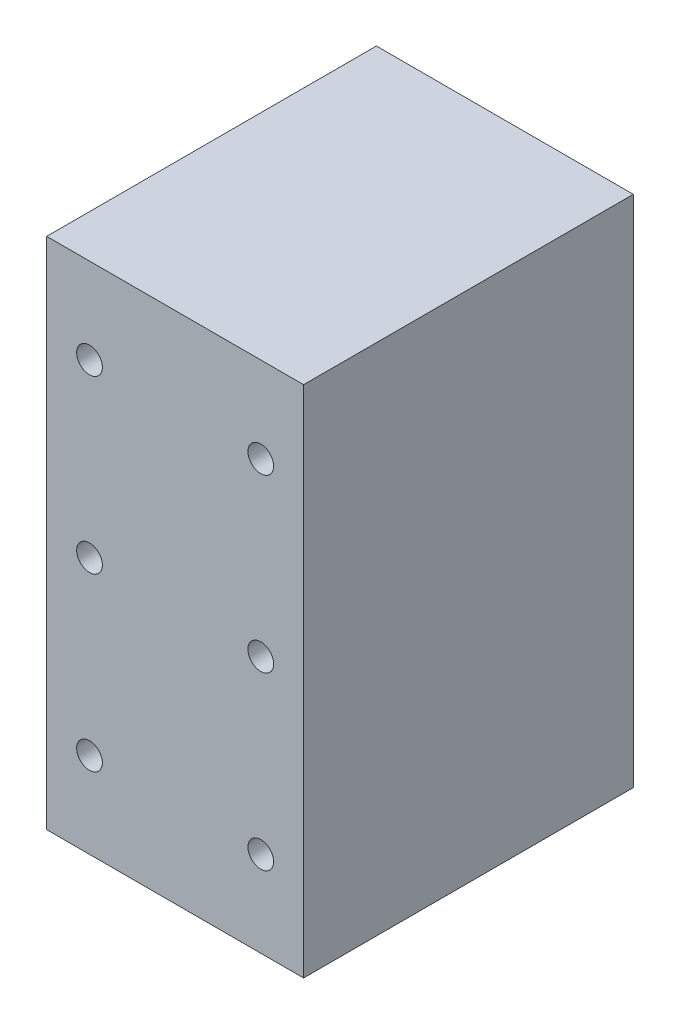
ISO-10303-21;
HEADER;
FILE_DESCRIPTION(('STEP AP214'),'2;1');
FILE_NAME('part.step','',(''),(''),'','','');
FILE_SCHEMA(('AUTOMOTIVE_DESIGN { 1 0 10303 214 1 1 1 1 }'));
ENDSEC;
DATA;
#1=APPLICATION_CONTEXT('core data for automotive mechanical design processes');
#2=APPLICATION_PROTOCOL_DEFINITION('international standard','automotive_design',2000,#1);
#3=PRODUCT_CONTEXT('',#1,'mechanical');
#4=PRODUCT('Part','Part','',(#3));
#5=PRODUCT_RELATED_PRODUCT_CATEGORY('part','',(#4));
#6=PRODUCT_DEFINITION_FORMATION('','',#4);
#7=PRODUCT_DEFINITION_CONTEXT('part definition',#1,'design');
#8=PRODUCT_DEFINITION('design','',#6,#7);
#9=PRODUCT_DEFINITION_SHAPE('','',#8);
#10=(LENGTH_UNIT() NAMED_UNIT(*) SI_UNIT(.MILLI.,.METRE.));
#11=(NAMED_UNIT(*) PLANE_ANGLE_UNIT() SI_UNIT($,.RADIAN.));
#12=(NAMED_UNIT(*) SI_UNIT($,.STERADIAN.) SOLID_ANGLE_UNIT());
#13=UNCERTAINTY_MEASURE_WITH_UNIT(LENGTH_MEASURE(1.E-05),#10,'distance_accuracy_value','');
#14=(GEOMETRIC_REPRESENTATION_CONTEXT(3) GLOBAL_UNCERTAINTY_ASSIGNED_CONTEXT((#13)) GLOBAL_UNIT_ASSIGNED_CONTEXT((#10,
#11,#12)) REPRESENTATION_CONTEXT('',''));
#15=CARTESIAN_POINT('',(0.,0.,0.));
#16=DIRECTION('',(0.,0.,1.));
#17=DIRECTION('',(1.,0.,0.));
#18=AXIS2_PLACEMENT_3D('',#15,#16,#17);
#19=CARTESIAN_POINT('',(-15.,-30.,38.5));
#20=DIRECTION('',(1.,0.,0.));
#21=DIRECTION('',(0.,0.,-1.));
#22=AXIS2_PLACEMENT_3D('',#19,#20,#21);
#23=PLANE('',#22);
#24=DIRECTION('',(0.,-1.,0.));
#25=VECTOR('',#24,1.);
#26=CARTESIAN_POINT('',(-15.,-30.,0.));
#27=LINE('',#26,#25);
#28=CARTESIAN_POINT('',(-15.,30.,0.));
#29=VERTEX_POINT('',#28);
#30=CARTESIAN_POINT('',(-15.,-30.,0.));
#31=VERTEX_POINT('',#30);
#32=EDGE_CURVE('E100',#29,#31,#27,.T.);
#33=ORIENTED_EDGE('',*,*,#32,.T.);
#34=DIRECTION('',(0.,0.,-1.));
#35=VECTOR('',#34,1.);
#36=CARTESIAN_POINT('',(-15.,-30.,38.5));
#37=LINE('',#36,#35);
#38=CARTESIAN_POINT('',(-15.,-30.,38.5));
#39=VERTEX_POINT('',#38);
#40=EDGE_CURVE('E91',#39,#31,#37,.T.);
#41=ORIENTED_EDGE('',*,*,#40,.F.);
#42=DIRECTION('',(0.,-1.,0.));
#43=VECTOR('',#42,1.);
#44=CARTESIAN_POINT('',(-15.,-30.,38.5));
#45=LINE('',#44,#43);
#46=CARTESIAN_POINT('',(-15.,30.,38.5));
#47=VERTEX_POINT('',#46);
#48=EDGE_CURVE('E85',#47,#39,#45,.T.);
#49=ORIENTED_EDGE('',*,*,#48,.F.);
#50=DIRECTION('',(0.,0.,-1.));
#51=VECTOR('',#50,1.);
#52=CARTESIAN_POINT('',(-15.,30.,38.5));
#53=LINE('',#52,#51);
#54=EDGE_CURVE('E96',#47,#29,#53,.T.);
#55=ORIENTED_EDGE('',*,*,#54,.T.);
#56=EDGE_LOOP('',(#33,#41,#49,#55));
#57=FACE_BOUND('',#56,.T.);
#58=ADVANCED_FACE('F31',(#57),#23,.F.);
#59=CARTESIAN_POINT('',(15.,-30.,38.5));
#60=DIRECTION('',(0.,1.,0.));
#61=DIRECTION('',(-1.,0.,0.));
#62=AXIS2_PLACEMENT_3D('',#59,#60,#61);
#63=PLANE('',#62);
#64=DIRECTION('',(1.,0.,0.));
#65=VECTOR('',#64,1.);
#66=CARTESIAN_POINT('',(15.,-30.,0.));
#67=LINE('',#66,#65);
#68=CARTESIAN_POINT('',(15.,-30.,0.));
#69=VERTEX_POINT('',#68);
#70=EDGE_CURVE('E90',#31,#69,#67,.T.);
#71=ORIENTED_EDGE('',*,*,#70,.T.);
#72=DIRECTION('',(0.,0.,-1.));
#73=VECTOR('',#72,1.);
#74=CARTESIAN_POINT('',(15.,-30.,38.5));
#75=LINE('',#74,#73);
#76=CARTESIAN_POINT('',(15.,-30.,38.5));
#77=VERTEX_POINT('',#76);
#78=EDGE_CURVE('E88',#77,#69,#75,.T.);
#79=ORIENTED_EDGE('',*,*,#78,.F.);
#80=DIRECTION('',(1.,0.,0.));
#81=VECTOR('',#80,1.);
#82=CARTESIAN_POINT('',(15.,-30.,38.5));
#83=LINE('',#82,#81);
#84=EDGE_CURVE('E79',#39,#77,#83,.T.);
#85=ORIENTED_EDGE('',*,*,#84,.F.);
#86=ORIENTED_EDGE('',*,*,#40,.T.);
#87=EDGE_LOOP('',(#71,#79,#85,#86));
#88=FACE_BOUND('',#87,.T.);
#89=ADVANCED_FACE('F89',(#88),#63,.F.);
#90=CARTESIAN_POINT('',(15.,-30.,38.5));
#91=DIRECTION('',(-1.,0.,0.));
#92=DIRECTION('',(0.,0.,1.));
#93=AXIS2_PLACEMENT_3D('',#90,#91,#92);
#94=PLANE('',#93);
#95=DIRECTION('',(0.,1.,0.));
#96=VECTOR('',#95,1.);
#97=CARTESIAN_POINT('',(15.,-30.,0.));
#98=LINE('',#97,#96);
#99=CARTESIAN_POINT('',(15.,30.,0.));
#100=VERTEX_POINT('',#99);
#101=EDGE_CURVE('E65',#69,#100,#98,.T.);
#102=ORIENTED_EDGE('',*,*,#101,.T.);
#103=DIRECTION('',(0.,0.,-1.));
#104=VECTOR('',#103,1.);
#105=CARTESIAN_POINT('',(15.,30.,38.5));
#106=LINE('',#105,#104);
#107=CARTESIAN_POINT('',(15.,30.,38.5));
#108=VERTEX_POINT('',#107);
#109=EDGE_CURVE('E92',#108,#100,#106,.T.);
#110=ORIENTED_EDGE('',*,*,#109,.F.);
#111=DIRECTION('',(0.,1.,0.));
#112=VECTOR('',#111,1.);
#113=CARTESIAN_POINT('',(15.,-30.,38.5));
#114=LINE('',#113,#112);
#115=EDGE_CURVE('E83',#77,#108,#114,.T.);
#116=ORIENTED_EDGE('',*,*,#115,.F.);
#117=ORIENTED_EDGE('',*,*,#78,.T.);
#118=EDGE_LOOP('',(#102,#110,#116,#117));
#119=FACE_BOUND('',#118,.T.);
#120=ADVANCED_FACE('F94',(#119),#94,.F.);
#121=CARTESIAN_POINT('',(15.,30.,38.5));
#122=DIRECTION('',(0.,-1.,0.));
#123=DIRECTION('',(1.,0.,0.));
#124=AXIS2_PLACEMENT_3D('',#121,#122,#123);
#125=PLANE('',#124);
#126=DIRECTION('',(-1.,0.,0.));
#127=VECTOR('',#126,1.);
#128=CARTESIAN_POINT('',(15.,30.,0.));
#129=LINE('',#128,#127);
#130=EDGE_CURVE('E71',#100,#29,#129,.T.);
#131=ORIENTED_EDGE('',*,*,#130,.T.);
#132=ORIENTED_EDGE('',*,*,#54,.F.);
#133=DIRECTION('',(-1.,0.,0.));
#134=VECTOR('',#133,1.);
#135=CARTESIAN_POINT('',(15.,30.,38.5));
#136=LINE('',#135,#134);
#137=EDGE_CURVE('E48',#108,#47,#136,.T.);
#138=ORIENTED_EDGE('',*,*,#137,.F.);
#139=ORIENTED_EDGE('',*,*,#109,.T.);
#140=EDGE_LOOP('',(#131,#132,#138,#139));
#141=FACE_BOUND('',#140,.T.);
#142=ADVANCED_FACE('F138',(#141),#125,.F.);
#143=CARTESIAN_POINT('',(-15.,30.,38.5));
#144=DIRECTION('',(0.,0.,1.));
#145=DIRECTION('',(1.,0.,0.));
#146=AXIS2_PLACEMENT_3D('',#143,#144,#145);
#147=PLANE('',#146);
#148=CARTESIAN_POINT('',(-10.,0.,38.5));
#149=DIRECTION('',(0.,0.,1.));
#150=DIRECTION('',(1.,0.,0.));
#151=AXIS2_PLACEMENT_3D('',#148,#149,#150);
#152=CIRCLE('',#151,1.5);
#153=CARTESIAN_POINT('',(-8.5,0.,38.5));
#154=VERTEX_POINT('',#153);
#155=EDGE_CURVE('E256',#154,#154,#152,.T.);
#156=ORIENTED_EDGE('',*,*,#155,.F.);
#157=EDGE_LOOP('',(#156));
#158=FACE_BOUND('',#157,.T.);
#159=CARTESIAN_POINT('',(-10.,20.,38.5));
#160=DIRECTION('',(0.,0.,1.));
#161=DIRECTION('',(1.,0.,0.));
#162=AXIS2_PLACEMENT_3D('',#159,#160,#161);
#163=CIRCLE('',#162,1.5);
#164=CARTESIAN_POINT('',(-8.5,20.,38.5));
#165=VERTEX_POINT('',#164);
#166=EDGE_CURVE('E255',#165,#165,#163,.T.);
#167=ORIENTED_EDGE('',*,*,#166,.F.);
#168=EDGE_LOOP('',(#167));
#169=FACE_BOUND('',#168,.T.);
#170=ORIENTED_EDGE('',*,*,#48,.T.);
#171=ORIENTED_EDGE('',*,*,#84,.T.);
#172=ORIENTED_EDGE('',*,*,#115,.T.);
#173=ORIENTED_EDGE('',*,*,#137,.T.);
#174=EDGE_LOOP('',(#170,#171,#172,#173));
#175=FACE_BOUND('',#174,.T.);
#176=CARTESIAN_POINT('',(-10.,-20.,38.5));
#177=DIRECTION('',(0.,0.,1.));
#178=DIRECTION('',(1.,0.,0.));
#179=AXIS2_PLACEMENT_3D('',#176,#177,#178);
#180=CIRCLE('',#179,1.5);
#181=CARTESIAN_POINT('',(-8.5,-20.,38.5));
#182=VERTEX_POINT('',#181);
#183=EDGE_CURVE('E113',#182,#182,#180,.T.);
#184=ORIENTED_EDGE('',*,*,#183,.F.);
#185=EDGE_LOOP('',(#184));
#186=FACE_BOUND('',#185,.T.);
#187=CARTESIAN_POINT('',(9.99999999999999,20.,38.5));
#188=DIRECTION('',(0.,0.,1.));
#189=DIRECTION('',(1.,0.,0.));
#190=AXIS2_PLACEMENT_3D('',#187,#188,#189);
#191=CIRCLE('',#190,1.5);
#192=CARTESIAN_POINT('',(11.5,20.,38.5));
#193=VERTEX_POINT('',#192);
#194=EDGE_CURVE('E119',#193,#193,#191,.T.);
#195=ORIENTED_EDGE('',*,*,#194,.F.);
#196=EDGE_LOOP('',(#195));
#197=FACE_BOUND('',#196,.T.);
#198=CARTESIAN_POINT('',(9.99999999999999,0.,38.5));
#199=DIRECTION('',(0.,0.,1.));
#200=DIRECTION('',(1.,0.,0.));
#201=AXIS2_PLACEMENT_3D('',#198,#199,#200);
#202=CIRCLE('',#201,1.5);
#203=CARTESIAN_POINT('',(11.5,0.,38.5));
#204=VERTEX_POINT('',#203);
#205=EDGE_CURVE('E125',#204,#204,#202,.T.);
#206=ORIENTED_EDGE('',*,*,#205,.F.);
#207=EDGE_LOOP('',(#206));
#208=FACE_BOUND('',#207,.T.);
#209=CARTESIAN_POINT('',(9.99999999999999,-20.,38.5));
#210=DIRECTION('',(0.,0.,1.));
#211=DIRECTION('',(1.,0.,0.));
#212=AXIS2_PLACEMENT_3D('',#209,#210,#211);
#213=CIRCLE('',#212,1.5);
#214=CARTESIAN_POINT('',(11.5,-20.,38.5));
#215=VERTEX_POINT('',#214);
#216=EDGE_CURVE('E11',#215,#215,#213,.T.);
#217=ORIENTED_EDGE('',*,*,#216,.F.);
#218=EDGE_LOOP('',(#217));
#219=FACE_BOUND('',#218,.T.);
#220=ADVANCED_FACE('F80',(#158,#169,#175,#186,#197,#208,#219),#147,.T.);
#221=CARTESIAN_POINT('',(-15.,30.,0.));
#222=DIRECTION('',(0.,0.,1.));
#223=DIRECTION('',(1.,0.,0.));
#224=AXIS2_PLACEMENT_3D('',#221,#222,#223);
#225=PLANE('',#224);
#226=CARTESIAN_POINT('',(-10.,0.,0.));
#227=DIRECTION('',(0.,0.,1.));
#228=DIRECTION('',(1.,0.,0.));
#229=AXIS2_PLACEMENT_3D('',#226,#227,#228);
#230=CIRCLE('',#229,1.5);
#231=CARTESIAN_POINT('',(-8.5,0.,0.));
#232=VERTEX_POINT('',#231);
#233=EDGE_CURVE('E260',#232,#232,#230,.T.);
#234=ORIENTED_EDGE('',*,*,#233,.T.);
#235=EDGE_LOOP('',(#234));
#236=FACE_BOUND('',#235,.T.);
#237=CARTESIAN_POINT('',(-10.,20.,0.));
#238=DIRECTION('',(0.,0.,1.));
#239=DIRECTION('',(1.,0.,0.));
#240=AXIS2_PLACEMENT_3D('',#237,#238,#239);
#241=CIRCLE('',#240,1.5);
#242=CARTESIAN_POINT('',(-8.5,20.,0.));
#243=VERTEX_POINT('',#242);
#244=EDGE_CURVE('E103',#243,#243,#241,.T.);
#245=ORIENTED_EDGE('',*,*,#244,.T.);
#246=EDGE_LOOP('',(#245));
#247=FACE_BOUND('',#246,.T.);
#248=ORIENTED_EDGE('',*,*,#32,.F.);
#249=ORIENTED_EDGE('',*,*,#130,.F.);
#250=ORIENTED_EDGE('',*,*,#101,.F.);
#251=ORIENTED_EDGE('',*,*,#70,.F.);
#252=EDGE_LOOP('',(#248,#249,#250,#251));
#253=FACE_BOUND('',#252,.T.);
#254=CARTESIAN_POINT('',(-10.,-20.,0.));
#255=DIRECTION('',(0.,0.,1.));
#256=DIRECTION('',(1.,0.,0.));
#257=AXIS2_PLACEMENT_3D('',#254,#255,#256);
#258=CIRCLE('',#257,1.5);
#259=CARTESIAN_POINT('',(-8.5,-20.,0.));
#260=VERTEX_POINT('',#259);
#261=EDGE_CURVE('E110',#260,#260,#258,.T.);
#262=ORIENTED_EDGE('',*,*,#261,.T.);
#263=EDGE_LOOP('',(#262));
#264=FACE_BOUND('',#263,.T.);
#265=CARTESIAN_POINT('',(9.99999999999999,20.,0.));
#266=DIRECTION('',(0.,0.,1.));
#267=DIRECTION('',(1.,0.,0.));
#268=AXIS2_PLACEMENT_3D('',#265,#266,#267);
#269=CIRCLE('',#268,1.5);
#270=CARTESIAN_POINT('',(11.5,20.,0.));
#271=VERTEX_POINT('',#270);
#272=EDGE_CURVE('E116',#271,#271,#269,.T.);
#273=ORIENTED_EDGE('',*,*,#272,.T.);
#274=EDGE_LOOP('',(#273));
#275=FACE_BOUND('',#274,.T.);
#276=CARTESIAN_POINT('',(9.99999999999999,0.,0.));
#277=DIRECTION('',(0.,0.,1.));
#278=DIRECTION('',(1.,0.,0.));
#279=AXIS2_PLACEMENT_3D('',#276,#277,#278);
#280=CIRCLE('',#279,1.5);
#281=CARTESIAN_POINT('',(11.5,0.,0.));
#282=VERTEX_POINT('',#281);
#283=EDGE_CURVE('E122',#282,#282,#280,.T.);
#284=ORIENTED_EDGE('',*,*,#283,.T.);
#285=EDGE_LOOP('',(#284));
#286=FACE_BOUND('',#285,.T.);
#287=CARTESIAN_POINT('',(9.99999999999999,-20.,0.));
#288=DIRECTION('',(0.,0.,1.));
#289=DIRECTION('',(1.,0.,0.));
#290=AXIS2_PLACEMENT_3D('',#287,#288,#289);
#291=CIRCLE('',#290,1.5);
#292=CARTESIAN_POINT('',(11.5,-20.,0.));
#293=VERTEX_POINT('',#292);
#294=EDGE_CURVE('E40',#293,#293,#291,.T.);
#295=ORIENTED_EDGE('',*,*,#294,.T.);
#296=EDGE_LOOP('',(#295));
#297=FACE_BOUND('',#296,.T.);
#298=ADVANCED_FACE('F130',(#236,#247,#253,#264,#275,#286,#297),#225,.F.);
#299=CARTESIAN_POINT('',(-10.,20.,0.));
#300=DIRECTION('',(0.,0.,1.));
#301=DIRECTION('',(1.,0.,0.));
#302=AXIS2_PLACEMENT_3D('',#299,#300,#301);
#303=CYLINDRICAL_SURFACE('',#302,1.5);
#304=ORIENTED_EDGE('',*,*,#244,.F.);
#305=EDGE_LOOP('',(#304));
#306=FACE_BOUND('',#305,.T.);
#307=ORIENTED_EDGE('',*,*,#166,.T.);
#308=EDGE_LOOP('',(#307));
#309=FACE_BOUND('',#308,.T.);
#310=ADVANCED_FACE('F145',(#306,#309),#303,.F.);
#311=CARTESIAN_POINT('',(-10.,0.,0.));
#312=DIRECTION('',(0.,0.,1.));
#313=DIRECTION('',(1.,0.,0.));
#314=AXIS2_PLACEMENT_3D('',#311,#312,#313);
#315=CYLINDRICAL_SURFACE('',#314,1.5);
#316=ORIENTED_EDGE('',*,*,#233,.F.);
#317=EDGE_LOOP('',(#316));
#318=FACE_BOUND('',#317,.T.);
#319=ORIENTED_EDGE('',*,*,#155,.T.);
#320=EDGE_LOOP('',(#319));
#321=FACE_BOUND('',#320,.T.);
#322=ADVANCED_FACE('F165',(#318,#321),#315,.F.);
#323=CARTESIAN_POINT('',(-10.,-20.,0.));
#324=DIRECTION('',(0.,0.,1.));
#325=DIRECTION('',(1.,0.,0.));
#326=AXIS2_PLACEMENT_3D('',#323,#324,#325);
#327=CYLINDRICAL_SURFACE('',#326,1.5);
#328=ORIENTED_EDGE('',*,*,#261,.F.);
#329=EDGE_LOOP('',(#328));
#330=FACE_BOUND('',#329,.T.);
#331=ORIENTED_EDGE('',*,*,#183,.T.);
#332=EDGE_LOOP('',(#331));
#333=FACE_BOUND('',#332,.T.);
#334=ADVANCED_FACE('F161',(#330,#333),#327,.F.);
#335=CARTESIAN_POINT('',(9.99999999999999,20.,0.));
#336=DIRECTION('',(0.,0.,1.));
#337=DIRECTION('',(1.,0.,0.));
#338=AXIS2_PLACEMENT_3D('',#335,#336,#337);
#339=CYLINDRICAL_SURFACE('',#338,1.5);
#340=ORIENTED_EDGE('',*,*,#272,.F.);
#341=EDGE_LOOP('',(#340));
#342=FACE_BOUND('',#341,.T.);
#343=ORIENTED_EDGE('',*,*,#194,.T.);
#344=EDGE_LOOP('',(#343));
#345=FACE_BOUND('',#344,.T.);
#346=ADVANCED_FACE('F164',(#342,#345),#339,.F.);
#347=CARTESIAN_POINT('',(9.99999999999999,0.,0.));
#348=DIRECTION('',(0.,0.,1.));
#349=DIRECTION('',(1.,0.,0.));
#350=AXIS2_PLACEMENT_3D('',#347,#348,#349);
#351=CYLINDRICAL_SURFACE('',#350,1.5);
#352=ORIENTED_EDGE('',*,*,#283,.F.);
#353=EDGE_LOOP('',(#352));
#354=FACE_BOUND('',#353,.T.);
#355=ORIENTED_EDGE('',*,*,#205,.T.);
#356=EDGE_LOOP('',(#355));
#357=FACE_BOUND('',#356,.T.);
#358=ADVANCED_FACE('F134',(#354,#357),#351,.F.);
#359=CARTESIAN_POINT('',(9.99999999999999,-20.,0.));
#360=DIRECTION('',(0.,0.,1.));
#361=DIRECTION('',(1.,0.,0.));
#362=AXIS2_PLACEMENT_3D('',#359,#360,#361);
#363=CYLINDRICAL_SURFACE('',#362,1.5);
#364=ORIENTED_EDGE('',*,*,#294,.F.);
#365=EDGE_LOOP('',(#364));
#366=FACE_BOUND('',#365,.T.);
#367=ORIENTED_EDGE('',*,*,#216,.T.);
#368=EDGE_LOOP('',(#367));
#369=FACE_BOUND('',#368,.T.);
#370=ADVANCED_FACE('F33',(#366,#369),#363,.F.);
#371=CLOSED_SHELL('',(#58,#89,#120,#142,#220,#298,#310,#322,#334,#346,#358,#370));
#372=MANIFOLD_SOLID_BREP('B2',#371);
#373=ADVANCED_BREP_SHAPE_REPRESENTATION('',(#18,#372),#14);
#374=SHAPE_DEFINITION_REPRESENTATION(#9,#373);
ENDSEC;
END-ISO-10303-21;
